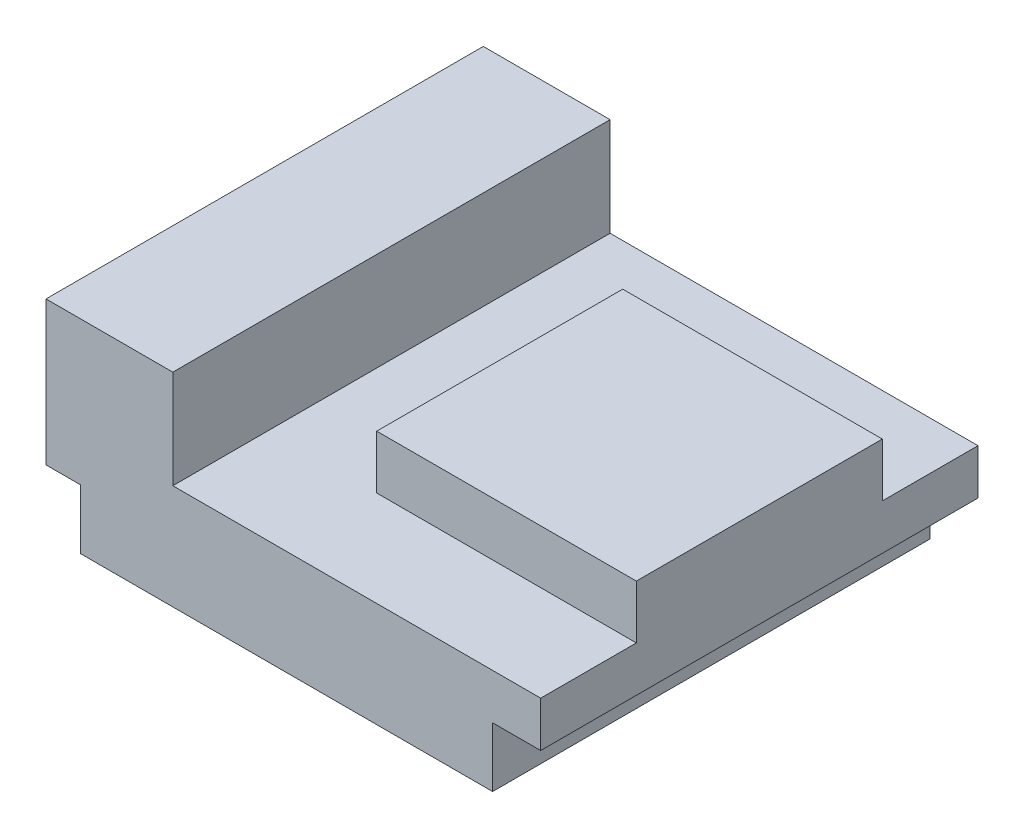
ISO-10303-21;
HEADER;
FILE_DESCRIPTION(('STEP AP214'),'2;1');
FILE_NAME('part.step','',(''),(''),'','','');
FILE_SCHEMA(('AUTOMOTIVE_DESIGN { 1 0 10303 214 1 1 1 1 }'));
ENDSEC;
DATA;
#1=APPLICATION_CONTEXT('core data for automotive mechanical design processes');
#2=APPLICATION_PROTOCOL_DEFINITION('international standard','automotive_design',2000,#1);
#3=PRODUCT_CONTEXT('',#1,'mechanical');
#4=PRODUCT('Part','Part','',(#3));
#5=PRODUCT_RELATED_PRODUCT_CATEGORY('part','',(#4));
#6=PRODUCT_DEFINITION_FORMATION('','',#4);
#7=PRODUCT_DEFINITION_CONTEXT('part definition',#1,'design');
#8=PRODUCT_DEFINITION('design','',#6,#7);
#9=PRODUCT_DEFINITION_SHAPE('','',#8);
#10=(LENGTH_UNIT() NAMED_UNIT(*) SI_UNIT(.MILLI.,.METRE.));
#11=(NAMED_UNIT(*) PLANE_ANGLE_UNIT() SI_UNIT($,.RADIAN.));
#12=(NAMED_UNIT(*) SI_UNIT($,.STERADIAN.) SOLID_ANGLE_UNIT());
#13=UNCERTAINTY_MEASURE_WITH_UNIT(LENGTH_MEASURE(1.E-05),#10,'distance_accuracy_value','');
#14=(GEOMETRIC_REPRESENTATION_CONTEXT(3) GLOBAL_UNCERTAINTY_ASSIGNED_CONTEXT((#13)) GLOBAL_UNIT_ASSIGNED_CONTEXT((#10,
#11,#12)) REPRESENTATION_CONTEXT('',''));
#15=CARTESIAN_POINT('',(0.,0.,0.));
#16=DIRECTION('',(0.,0.,1.));
#17=DIRECTION('',(1.,0.,0.));
#18=AXIS2_PLACEMENT_3D('',#15,#16,#17);
#19=CARTESIAN_POINT('',(0.,1.66,0.));
#20=DIRECTION('',(0.,-1.,0.));
#21=DIRECTION('',(0.,0.,-1.));
#22=AXIS2_PLACEMENT_3D('',#19,#20,#21);
#23=PLANE('',#22);
#24=DIRECTION('',(0.,0.,-1.));
#25=VECTOR('',#24,1.);
#26=CARTESIAN_POINT('',(4.64,1.66,-16.));
#27=LINE('',#26,#25);
#28=CARTESIAN_POINT('',(4.64,1.66,0.));
#29=VERTEX_POINT('',#28);
#30=CARTESIAN_POINT('',(4.64,1.66,-16.));
#31=VERTEX_POINT('',#30);
#32=EDGE_CURVE('E53',#29,#31,#27,.T.);
#33=ORIENTED_EDGE('',*,*,#32,.F.);
#34=DIRECTION('',(1.,0.,0.));
#35=VECTOR('',#34,1.);
#36=CARTESIAN_POINT('',(0.,1.66,0.));
#37=LINE('',#36,#35);
#38=CARTESIAN_POINT('',(18.1,1.66,0.));
#39=VERTEX_POINT('',#38);
#40=EDGE_CURVE('E229',#29,#39,#37,.T.);
#41=ORIENTED_EDGE('',*,*,#40,.T.);
#42=DIRECTION('',(0.,0.,-1.));
#43=VECTOR('',#42,1.);
#44=CARTESIAN_POINT('',(18.1,1.66,0.));
#45=LINE('',#44,#43);
#46=CARTESIAN_POINT('',(18.1,1.66,-3.5));
#47=VERTEX_POINT('',#46);
#48=EDGE_CURVE('E233',#39,#47,#45,.T.);
#49=ORIENTED_EDGE('',*,*,#48,.T.);
#50=DIRECTION('',(1.,0.,0.));
#51=VECTOR('',#50,1.);
#52=CARTESIAN_POINT('',(8.6,1.66,-3.5));
#53=LINE('',#52,#51);
#54=CARTESIAN_POINT('',(8.6,1.66,-3.5));
#55=VERTEX_POINT('',#54);
#56=EDGE_CURVE('E177',#55,#47,#53,.T.);
#57=ORIENTED_EDGE('',*,*,#56,.F.);
#58=DIRECTION('',(0.,0.,1.));
#59=VECTOR('',#58,1.);
#60=CARTESIAN_POINT('',(8.6,1.66,-12.5));
#61=LINE('',#60,#59);
#62=CARTESIAN_POINT('',(8.6,1.66,-12.5));
#63=VERTEX_POINT('',#62);
#64=EDGE_CURVE('E186',#63,#55,#61,.T.);
#65=ORIENTED_EDGE('',*,*,#64,.F.);
#66=DIRECTION('',(-1.,0.,0.));
#67=VECTOR('',#66,1.);
#68=CARTESIAN_POINT('',(8.6,1.66,-12.5));
#69=LINE('',#68,#67);
#70=CARTESIAN_POINT('',(18.1,1.66,-12.5));
#71=VERTEX_POINT('',#70);
#72=EDGE_CURVE('E172',#71,#63,#69,.T.);
#73=ORIENTED_EDGE('',*,*,#72,.F.);
#74=CARTESIAN_POINT('',(18.1,1.66,-16.));
#75=VERTEX_POINT('',#74);
#76=EDGE_CURVE('E231',#71,#75,#45,.T.);
#77=ORIENTED_EDGE('',*,*,#76,.T.);
#78=DIRECTION('',(-1.,0.,0.));
#79=VECTOR('',#78,1.);
#80=CARTESIAN_POINT('',(0.,1.66,-16.));
#81=LINE('',#80,#79);
#82=EDGE_CURVE('E58',#75,#31,#81,.T.);
#83=ORIENTED_EDGE('',*,*,#82,.T.);
#84=EDGE_LOOP('',(#33,#41,#49,#57,#65,#73,#77,#83));
#85=FACE_BOUND('',#84,.T.);
#86=ADVANCED_FACE('F37',(#85),#23,.F.);
#87=CARTESIAN_POINT('',(0.,0.,0.));
#88=DIRECTION('',(0.,-1.,0.));
#89=DIRECTION('',(0.,0.,-1.));
#90=AXIS2_PLACEMENT_3D('',#87,#88,#89);
#91=PLANE('',#90);
#92=DIRECTION('',(0.,0.,-1.));
#93=VECTOR('',#92,1.);
#94=CARTESIAN_POINT('',(1.26,0.,0.));
#95=LINE('',#94,#93);
#96=CARTESIAN_POINT('',(1.26,0.,0.));
#97=VERTEX_POINT('',#96);
#98=CARTESIAN_POINT('',(1.26,0.,-16.));
#99=VERTEX_POINT('',#98);
#100=EDGE_CURVE('E202',#97,#99,#95,.T.);
#101=ORIENTED_EDGE('',*,*,#100,.F.);
#102=DIRECTION('',(1.,0.,0.));
#103=VECTOR('',#102,1.);
#104=CARTESIAN_POINT('',(0.,0.,0.));
#105=LINE('',#104,#103);
#106=CARTESIAN_POINT('',(0.,0.,0.));
#107=VERTEX_POINT('',#106);
#108=EDGE_CURVE('E239',#107,#97,#105,.T.);
#109=ORIENTED_EDGE('',*,*,#108,.F.);
#110=DIRECTION('',(0.,0.,1.));
#111=VECTOR('',#110,1.);
#112=CARTESIAN_POINT('',(0.,0.,0.));
#113=LINE('',#112,#111);
#114=CARTESIAN_POINT('',(0.,0.,-16.));
#115=VERTEX_POINT('',#114);
#116=EDGE_CURVE('E144',#115,#107,#113,.T.);
#117=ORIENTED_EDGE('',*,*,#116,.F.);
#118=DIRECTION('',(-1.,0.,0.));
#119=VECTOR('',#118,1.);
#120=CARTESIAN_POINT('',(0.,0.,-16.));
#121=LINE('',#120,#119);
#122=EDGE_CURVE('E243',#99,#115,#121,.T.);
#123=ORIENTED_EDGE('',*,*,#122,.F.);
#124=EDGE_LOOP('',(#101,#109,#117,#123));
#125=FACE_BOUND('',#124,.T.);
#126=ADVANCED_FACE('F276',(#125),#91,.T.);
#127=CARTESIAN_POINT('',(0.,1.66,0.));
#128=DIRECTION('',(1.,0.,0.));
#129=DIRECTION('',(0.,0.,-1.));
#130=AXIS2_PLACEMENT_3D('',#127,#128,#129);
#131=PLANE('',#130);
#132=ORIENTED_EDGE('',*,*,#116,.T.);
#133=DIRECTION('',(0.,-1.,0.));
#134=VECTOR('',#133,1.);
#135=CARTESIAN_POINT('',(0.,1.66,0.));
#136=LINE('',#135,#134);
#137=CARTESIAN_POINT('',(0.,5.26,0.));
#138=VERTEX_POINT('',#137);
#139=EDGE_CURVE('E46',#138,#107,#136,.T.);
#140=ORIENTED_EDGE('',*,*,#139,.F.);
#141=DIRECTION('',(0.,0.,1.));
#142=VECTOR('',#141,1.);
#143=CARTESIAN_POINT('',(0.,5.26,-16.));
#144=LINE('',#143,#142);
#145=CARTESIAN_POINT('',(0.,5.26,-16.));
#146=VERTEX_POINT('',#145);
#147=EDGE_CURVE('E142',#146,#138,#144,.T.);
#148=ORIENTED_EDGE('',*,*,#147,.F.);
#149=DIRECTION('',(0.,-1.,0.));
#150=VECTOR('',#149,1.);
#151=CARTESIAN_POINT('',(0.,1.66,-16.));
#152=LINE('',#151,#150);
#153=EDGE_CURVE('E236',#146,#115,#152,.T.);
#154=ORIENTED_EDGE('',*,*,#153,.T.);
#155=EDGE_LOOP('',(#132,#140,#148,#154));
#156=FACE_BOUND('',#155,.T.);
#157=ADVANCED_FACE('F139',(#156),#131,.F.);
#158=CARTESIAN_POINT('',(0.,1.66,0.));
#159=DIRECTION('',(0.,0.,-1.));
#160=DIRECTION('',(-1.,0.,0.));
#161=AXIS2_PLACEMENT_3D('',#158,#159,#160);
#162=PLANE('',#161);
#163=ORIENTED_EDGE('',*,*,#108,.T.);
#164=DIRECTION('',(0.,1.,0.));
#165=VECTOR('',#164,1.);
#166=CARTESIAN_POINT('',(1.26,-2.18,0.));
#167=LINE('',#166,#165);
#168=CARTESIAN_POINT('',(1.26,-2.18,0.));
#169=VERTEX_POINT('',#168);
#170=EDGE_CURVE('E213',#169,#97,#167,.T.);
#171=ORIENTED_EDGE('',*,*,#170,.F.);
#172=DIRECTION('',(-1.,0.,0.));
#173=VECTOR('',#172,1.);
#174=CARTESIAN_POINT('',(1.26,-2.18,0.));
#175=LINE('',#174,#173);
#176=CARTESIAN_POINT('',(16.34,-2.18,0.));
#177=VERTEX_POINT('',#176);
#178=EDGE_CURVE('E211',#177,#169,#175,.T.);
#179=ORIENTED_EDGE('',*,*,#178,.F.);
#180=DIRECTION('',(0.,1.,0.));
#181=VECTOR('',#180,1.);
#182=CARTESIAN_POINT('',(16.34,-2.18,0.));
#183=LINE('',#182,#181);
#184=CARTESIAN_POINT('',(16.34,0.,0.));
#185=VERTEX_POINT('',#184);
#186=EDGE_CURVE('E220',#177,#185,#183,.T.);
#187=ORIENTED_EDGE('',*,*,#186,.T.);
#188=CARTESIAN_POINT('',(18.1,0.,0.));
#189=VERTEX_POINT('',#188);
#190=EDGE_CURVE('E238',#185,#189,#105,.T.);
#191=ORIENTED_EDGE('',*,*,#190,.T.);
#192=DIRECTION('',(0.,-1.,0.));
#193=VECTOR('',#192,1.);
#194=CARTESIAN_POINT('',(18.1,1.66,0.));
#195=LINE('',#194,#193);
#196=EDGE_CURVE('E147',#39,#189,#195,.T.);
#197=ORIENTED_EDGE('',*,*,#196,.F.);
#198=ORIENTED_EDGE('',*,*,#40,.F.);
#199=DIRECTION('',(0.,-1.,0.));
#200=VECTOR('',#199,1.);
#201=CARTESIAN_POINT('',(4.64,5.26,0.));
#202=LINE('',#201,#200);
#203=CARTESIAN_POINT('',(4.64,5.26,0.));
#204=VERTEX_POINT('',#203);
#205=EDGE_CURVE('E152',#204,#29,#202,.T.);
#206=ORIENTED_EDGE('',*,*,#205,.F.);
#207=DIRECTION('',(1.,0.,0.));
#208=VECTOR('',#207,1.);
#209=CARTESIAN_POINT('',(0.,5.26,0.));
#210=LINE('',#209,#208);
#211=EDGE_CURVE('E149',#138,#204,#210,.T.);
#212=ORIENTED_EDGE('',*,*,#211,.F.);
#213=ORIENTED_EDGE('',*,*,#139,.T.);
#214=EDGE_LOOP('',(#163,#171,#179,#187,#191,#197,#198,#206,#212,#213));
#215=FACE_BOUND('',#214,.T.);
#216=ADVANCED_FACE('F150',(#215),#162,.F.);
#217=CARTESIAN_POINT('',(18.1,1.66,0.));
#218=DIRECTION('',(-1.,0.,0.));
#219=DIRECTION('',(0.,0.,1.));
#220=AXIS2_PLACEMENT_3D('',#217,#218,#219);
#221=PLANE('',#220);
#222=DIRECTION('',(0.,0.,-1.));
#223=VECTOR('',#222,1.);
#224=CARTESIAN_POINT('',(18.1,0.,0.));
#225=LINE('',#224,#223);
#226=CARTESIAN_POINT('',(18.1,0.,-16.));
#227=VERTEX_POINT('',#226);
#228=EDGE_CURVE('E241',#189,#227,#225,.T.);
#229=ORIENTED_EDGE('',*,*,#228,.T.);
#230=DIRECTION('',(0.,-1.,0.));
#231=VECTOR('',#230,1.);
#232=CARTESIAN_POINT('',(18.1,1.66,-16.));
#233=LINE('',#232,#231);
#234=EDGE_CURVE('E247',#75,#227,#233,.T.);
#235=ORIENTED_EDGE('',*,*,#234,.F.);
#236=ORIENTED_EDGE('',*,*,#76,.F.);
#237=DIRECTION('',(0.,-1.,0.));
#238=VECTOR('',#237,1.);
#239=CARTESIAN_POINT('',(18.1,3.62,-12.5));
#240=LINE('',#239,#238);
#241=CARTESIAN_POINT('',(18.1,3.62,-12.5));
#242=VERTEX_POINT('',#241);
#243=EDGE_CURVE('E199',#242,#71,#240,.T.);
#244=ORIENTED_EDGE('',*,*,#243,.F.);
#245=DIRECTION('',(0.,0.,-1.));
#246=VECTOR('',#245,1.);
#247=CARTESIAN_POINT('',(18.1,3.62,-12.5));
#248=LINE('',#247,#246);
#249=CARTESIAN_POINT('',(18.1,3.62,-3.5));
#250=VERTEX_POINT('',#249);
#251=EDGE_CURVE('E173',#250,#242,#248,.T.);
#252=ORIENTED_EDGE('',*,*,#251,.F.);
#253=DIRECTION('',(0.,-1.,0.));
#254=VECTOR('',#253,1.);
#255=CARTESIAN_POINT('',(18.1,3.62,-3.5));
#256=LINE('',#255,#254);
#257=EDGE_CURVE('E183',#250,#47,#256,.T.);
#258=ORIENTED_EDGE('',*,*,#257,.T.);
#259=ORIENTED_EDGE('',*,*,#48,.F.);
#260=ORIENTED_EDGE('',*,*,#196,.T.);
#261=EDGE_LOOP('',(#229,#235,#236,#244,#252,#258,#259,#260));
#262=FACE_BOUND('',#261,.T.);
#263=ADVANCED_FACE('F255',(#262),#221,.F.);
#264=CARTESIAN_POINT('',(0.,1.66,-16.));
#265=DIRECTION('',(0.,0.,1.));
#266=DIRECTION('',(1.,0.,0.));
#267=AXIS2_PLACEMENT_3D('',#264,#265,#266);
#268=PLANE('',#267);
#269=CARTESIAN_POINT('',(16.34,0.,-16.));
#270=VERTEX_POINT('',#269);
#271=EDGE_CURVE('E232',#227,#270,#121,.T.);
#272=ORIENTED_EDGE('',*,*,#271,.T.);
#273=DIRECTION('',(0.,1.,0.));
#274=VECTOR('',#273,1.);
#275=CARTESIAN_POINT('',(16.34,-2.18,-16.));
#276=LINE('',#275,#274);
#277=CARTESIAN_POINT('',(16.34,-2.18,-16.));
#278=VERTEX_POINT('',#277);
#279=EDGE_CURVE('E223',#278,#270,#276,.T.);
#280=ORIENTED_EDGE('',*,*,#279,.F.);
#281=DIRECTION('',(1.,0.,0.));
#282=VECTOR('',#281,1.);
#283=CARTESIAN_POINT('',(1.26,-2.18,-16.));
#284=LINE('',#283,#282);
#285=CARTESIAN_POINT('',(1.26,-2.18,-16.));
#286=VERTEX_POINT('',#285);
#287=EDGE_CURVE('E206',#286,#278,#284,.T.);
#288=ORIENTED_EDGE('',*,*,#287,.F.);
#289=DIRECTION('',(0.,1.,0.));
#290=VECTOR('',#289,1.);
#291=CARTESIAN_POINT('',(1.26,-2.18,-16.));
#292=LINE('',#291,#290);
#293=EDGE_CURVE('E226',#286,#99,#292,.T.);
#294=ORIENTED_EDGE('',*,*,#293,.T.);
#295=ORIENTED_EDGE('',*,*,#122,.T.);
#296=ORIENTED_EDGE('',*,*,#153,.F.);
#297=DIRECTION('',(-1.,0.,0.));
#298=VECTOR('',#297,1.);
#299=CARTESIAN_POINT('',(0.,5.26,-16.));
#300=LINE('',#299,#298);
#301=CARTESIAN_POINT('',(4.64,5.26,-16.));
#302=VERTEX_POINT('',#301);
#303=EDGE_CURVE('E160',#302,#146,#300,.T.);
#304=ORIENTED_EDGE('',*,*,#303,.F.);
#305=DIRECTION('',(0.,-1.,0.));
#306=VECTOR('',#305,1.);
#307=CARTESIAN_POINT('',(4.64,5.26,-16.));
#308=LINE('',#307,#306);
#309=EDGE_CURVE('E167',#302,#31,#308,.T.);
#310=ORIENTED_EDGE('',*,*,#309,.T.);
#311=ORIENTED_EDGE('',*,*,#82,.F.);
#312=ORIENTED_EDGE('',*,*,#234,.T.);
#313=EDGE_LOOP('',(#272,#280,#288,#294,#295,#296,#304,#310,#311,#312));
#314=FACE_BOUND('',#313,.T.);
#315=ADVANCED_FACE('F262',(#314),#268,.F.);
#316=DIRECTION('',(0.,0.,1.));
#317=VECTOR('',#316,1.);
#318=CARTESIAN_POINT('',(16.34,0.,0.));
#319=LINE('',#318,#317);
#320=EDGE_CURVE('E207',#270,#185,#319,.T.);
#321=ORIENTED_EDGE('',*,*,#320,.F.);
#322=ORIENTED_EDGE('',*,*,#271,.F.);
#323=ORIENTED_EDGE('',*,*,#228,.F.);
#324=ORIENTED_EDGE('',*,*,#190,.F.);
#325=EDGE_LOOP('',(#321,#322,#323,#324));
#326=FACE_BOUND('',#325,.T.);
#327=ADVANCED_FACE('F259',(#326),#91,.T.);
#328=CARTESIAN_POINT('',(1.26,-2.18,0.));
#329=DIRECTION('',(1.,0.,0.));
#330=DIRECTION('',(0.,0.,-1.));
#331=AXIS2_PLACEMENT_3D('',#328,#329,#330);
#332=PLANE('',#331);
#333=ORIENTED_EDGE('',*,*,#100,.T.);
#334=ORIENTED_EDGE('',*,*,#293,.F.);
#335=DIRECTION('',(0.,0.,-1.));
#336=VECTOR('',#335,1.);
#337=CARTESIAN_POINT('',(1.26,-2.18,0.));
#338=LINE('',#337,#336);
#339=EDGE_CURVE('E203',#169,#286,#338,.T.);
#340=ORIENTED_EDGE('',*,*,#339,.F.);
#341=ORIENTED_EDGE('',*,*,#170,.T.);
#342=EDGE_LOOP('',(#333,#334,#340,#341));
#343=FACE_BOUND('',#342,.T.);
#344=ADVANCED_FACE('F274',(#343),#332,.F.);
#345=CARTESIAN_POINT('',(16.34,-2.18,0.));
#346=DIRECTION('',(-1.,0.,0.));
#347=DIRECTION('',(0.,0.,1.));
#348=AXIS2_PLACEMENT_3D('',#345,#346,#347);
#349=PLANE('',#348);
#350=ORIENTED_EDGE('',*,*,#320,.T.);
#351=ORIENTED_EDGE('',*,*,#186,.F.);
#352=DIRECTION('',(0.,0.,1.));
#353=VECTOR('',#352,1.);
#354=CARTESIAN_POINT('',(16.34,-2.18,0.));
#355=LINE('',#354,#353);
#356=EDGE_CURVE('E209',#278,#177,#355,.T.);
#357=ORIENTED_EDGE('',*,*,#356,.F.);
#358=ORIENTED_EDGE('',*,*,#279,.T.);
#359=EDGE_LOOP('',(#350,#351,#357,#358));
#360=FACE_BOUND('',#359,.T.);
#361=ADVANCED_FACE('F265',(#360),#349,.F.);
#362=CARTESIAN_POINT('',(0.,-2.18,0.));
#363=DIRECTION('',(0.,-1.,0.));
#364=DIRECTION('',(0.,0.,-1.));
#365=AXIS2_PLACEMENT_3D('',#362,#363,#364);
#366=PLANE('',#365);
#367=CARTESIAN_POINT('',(8.26,-2.18,-8.));
#368=DIRECTION('',(0.,-1.,0.));
#369=DIRECTION('',(0.,0.,-1.));
#370=AXIS2_PLACEMENT_3D('',#367,#368,#369);
#371=CIRCLE('',#370,1.8);
#372=CARTESIAN_POINT('',(8.26,-2.18,-9.8));
#373=VERTEX_POINT('',#372);
#374=EDGE_CURVE('E11',#373,#373,#371,.F.);
#375=ORIENTED_EDGE('',*,*,#374,.T.);
#376=EDGE_LOOP('',(#375));
#377=FACE_BOUND('',#376,.T.);
#378=ORIENTED_EDGE('',*,*,#339,.T.);
#379=ORIENTED_EDGE('',*,*,#287,.T.);
#380=ORIENTED_EDGE('',*,*,#356,.T.);
#381=ORIENTED_EDGE('',*,*,#178,.T.);
#382=EDGE_LOOP('',(#378,#379,#380,#381));
#383=FACE_BOUND('',#382,.T.);
#384=ADVANCED_FACE('F269',(#377,#383),#366,.T.);
#385=CARTESIAN_POINT('',(8.6,3.62,-12.5));
#386=DIRECTION('',(0.,0.,1.));
#387=DIRECTION('',(1.,0.,0.));
#388=AXIS2_PLACEMENT_3D('',#385,#386,#387);
#389=PLANE('',#388);
#390=ORIENTED_EDGE('',*,*,#72,.T.);
#391=DIRECTION('',(0.,-1.,0.));
#392=VECTOR('',#391,1.);
#393=CARTESIAN_POINT('',(8.6,3.62,-12.5));
#394=LINE('',#393,#392);
#395=CARTESIAN_POINT('',(8.6,3.62,-12.5));
#396=VERTEX_POINT('',#395);
#397=EDGE_CURVE('E196',#396,#63,#394,.T.);
#398=ORIENTED_EDGE('',*,*,#397,.F.);
#399=DIRECTION('',(-1.,0.,0.));
#400=VECTOR('',#399,1.);
#401=CARTESIAN_POINT('',(8.6,3.62,-12.5));
#402=LINE('',#401,#400);
#403=EDGE_CURVE('E176',#242,#396,#402,.T.);
#404=ORIENTED_EDGE('',*,*,#403,.F.);
#405=ORIENTED_EDGE('',*,*,#243,.T.);
#406=EDGE_LOOP('',(#390,#398,#404,#405));
#407=FACE_BOUND('',#406,.T.);
#408=ADVANCED_FACE('F318',(#407),#389,.F.);
#409=CARTESIAN_POINT('',(8.6,3.62,-12.5));
#410=DIRECTION('',(1.,0.,0.));
#411=DIRECTION('',(0.,0.,-1.));
#412=AXIS2_PLACEMENT_3D('',#409,#410,#411);
#413=PLANE('',#412);
#414=ORIENTED_EDGE('',*,*,#64,.T.);
#415=DIRECTION('',(0.,-1.,0.));
#416=VECTOR('',#415,1.);
#417=CARTESIAN_POINT('',(8.6,3.62,-3.5));
#418=LINE('',#417,#416);
#419=CARTESIAN_POINT('',(8.6,3.62,-3.5));
#420=VERTEX_POINT('',#419);
#421=EDGE_CURVE('E193',#420,#55,#418,.T.);
#422=ORIENTED_EDGE('',*,*,#421,.F.);
#423=DIRECTION('',(0.,0.,1.));
#424=VECTOR('',#423,1.);
#425=CARTESIAN_POINT('',(8.6,3.62,-12.5));
#426=LINE('',#425,#424);
#427=EDGE_CURVE('E179',#396,#420,#426,.T.);
#428=ORIENTED_EDGE('',*,*,#427,.F.);
#429=ORIENTED_EDGE('',*,*,#397,.T.);
#430=EDGE_LOOP('',(#414,#422,#428,#429));
#431=FACE_BOUND('',#430,.T.);
#432=ADVANCED_FACE('F322',(#431),#413,.F.);
#433=CARTESIAN_POINT('',(8.6,3.62,-3.5));
#434=DIRECTION('',(0.,0.,-1.));
#435=DIRECTION('',(-1.,0.,0.));
#436=AXIS2_PLACEMENT_3D('',#433,#434,#435);
#437=PLANE('',#436);
#438=ORIENTED_EDGE('',*,*,#56,.T.);
#439=ORIENTED_EDGE('',*,*,#257,.F.);
#440=DIRECTION('',(1.,0.,0.));
#441=VECTOR('',#440,1.);
#442=CARTESIAN_POINT('',(8.6,3.62,-3.5));
#443=LINE('',#442,#441);
#444=EDGE_CURVE('E181',#420,#250,#443,.T.);
#445=ORIENTED_EDGE('',*,*,#444,.F.);
#446=ORIENTED_EDGE('',*,*,#421,.T.);
#447=EDGE_LOOP('',(#438,#439,#445,#446));
#448=FACE_BOUND('',#447,.T.);
#449=ADVANCED_FACE('F333',(#448),#437,.F.);
#450=CARTESIAN_POINT('',(0.,3.62,0.));
#451=DIRECTION('',(0.,1.,0.));
#452=DIRECTION('',(0.,0.,1.));
#453=AXIS2_PLACEMENT_3D('',#450,#451,#452);
#454=PLANE('',#453);
#455=ORIENTED_EDGE('',*,*,#251,.T.);
#456=ORIENTED_EDGE('',*,*,#403,.T.);
#457=ORIENTED_EDGE('',*,*,#427,.T.);
#458=ORIENTED_EDGE('',*,*,#444,.T.);
#459=EDGE_LOOP('',(#455,#456,#457,#458));
#460=FACE_BOUND('',#459,.T.);
#461=ADVANCED_FACE('F343',(#460),#454,.T.);
#462=CARTESIAN_POINT('',(4.64,5.26,-16.));
#463=DIRECTION('',(-1.,0.,0.));
#464=DIRECTION('',(0.,0.,1.));
#465=AXIS2_PLACEMENT_3D('',#462,#463,#464);
#466=PLANE('',#465);
#467=ORIENTED_EDGE('',*,*,#32,.T.);
#468=ORIENTED_EDGE('',*,*,#309,.F.);
#469=DIRECTION('',(0.,0.,-1.));
#470=VECTOR('',#469,1.);
#471=CARTESIAN_POINT('',(4.64,5.26,-16.));
#472=LINE('',#471,#470);
#473=EDGE_CURVE('E155',#204,#302,#472,.T.);
#474=ORIENTED_EDGE('',*,*,#473,.F.);
#475=ORIENTED_EDGE('',*,*,#205,.T.);
#476=EDGE_LOOP('',(#467,#468,#474,#475));
#477=FACE_BOUND('',#476,.T.);
#478=ADVANCED_FACE('F353',(#477),#466,.F.);
#479=CARTESIAN_POINT('',(0.,5.26,0.));
#480=DIRECTION('',(0.,1.,0.));
#481=DIRECTION('',(0.,0.,1.));
#482=AXIS2_PLACEMENT_3D('',#479,#480,#481);
#483=PLANE('',#482);
#484=ORIENTED_EDGE('',*,*,#147,.T.);
#485=ORIENTED_EDGE('',*,*,#211,.T.);
#486=ORIENTED_EDGE('',*,*,#473,.T.);
#487=ORIENTED_EDGE('',*,*,#303,.T.);
#488=EDGE_LOOP('',(#484,#485,#486,#487));
#489=FACE_BOUND('',#488,.T.);
#490=ADVANCED_FACE('F158',(#489),#483,.T.);
#491=CARTESIAN_POINT('',(8.26,-2.48,-8.));
#492=DIRECTION('',(0.,-1.,0.));
#493=DIRECTION('',(0.,0.,-1.));
#494=AXIS2_PLACEMENT_3D('',#491,#492,#493);
#495=PLANE('',#494);
#496=CARTESIAN_POINT('',(8.26,-2.48,-8.));
#497=DIRECTION('',(0.,-1.,0.));
#498=DIRECTION('',(0.,0.,-1.));
#499=AXIS2_PLACEMENT_3D('',#496,#497,#498);
#500=CIRCLE('',#499,1.5);
#501=CARTESIAN_POINT('',(8.26,-2.48,-9.5));
#502=VERTEX_POINT('',#501);
#503=EDGE_CURVE('E162',#502,#502,#500,.T.);
#504=ORIENTED_EDGE('',*,*,#503,.T.);
#505=EDGE_LOOP('',(#504));
#506=FACE_BOUND('',#505,.T.);
#507=ADVANCED_FACE('F401',(#506),#495,.T.);
#508=CARTESIAN_POINT('',(8.26,-2.48,-8.));
#509=DIRECTION('',(0.,1.,0.));
#510=DIRECTION('',(0.,0.,1.));
#511=AXIS2_PLACEMENT_3D('',#508,#509,#510);
#512=CONICAL_SURFACE('',#511,1.5,0.785398163397443);
#513=ORIENTED_EDGE('',*,*,#374,.F.);
#514=EDGE_LOOP('',(#513));
#515=FACE_BOUND('',#514,.T.);
#516=ORIENTED_EDGE('',*,*,#503,.F.);
#517=EDGE_LOOP('',(#516));
#518=FACE_BOUND('',#517,.T.);
#519=ADVANCED_FACE('F40',(#515,#518),#512,.T.);
#520=CLOSED_SHELL('',(#86,#126,#157,#216,#263,#315,#327,#344,#361,#384,#408,#432,#449,#461,#478,
#490,#507,#519));
#521=MANIFOLD_SOLID_BREP('B2',#520);
#522=ADVANCED_BREP_SHAPE_REPRESENTATION('',(#18,#521),#14);
#523=SHAPE_DEFINITION_REPRESENTATION(#9,#522);
ENDSEC;
END-ISO-10303-21;
